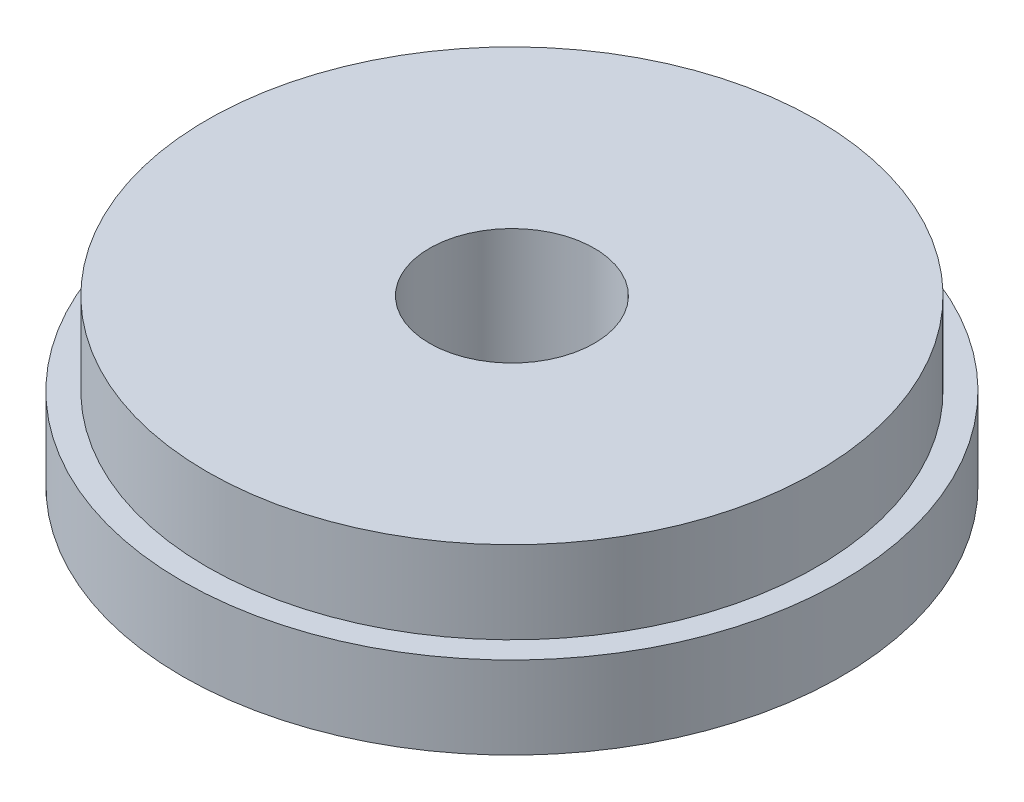
ISO-10303-21;
HEADER;
FILE_DESCRIPTION(('STEP AP214'),'2;1');
FILE_NAME('part.step','',(''),(''),'','','');
FILE_SCHEMA(('AUTOMOTIVE_DESIGN { 1 0 10303 214 1 1 1 1 }'));
ENDSEC;
DATA;
#1=APPLICATION_CONTEXT('core data for automotive mechanical design processes');
#2=APPLICATION_PROTOCOL_DEFINITION('international standard','automotive_design',2000,#1);
#3=PRODUCT_CONTEXT('',#1,'mechanical');
#4=PRODUCT('Part','Part','',(#3));
#5=PRODUCT_RELATED_PRODUCT_CATEGORY('part','',(#4));
#6=PRODUCT_DEFINITION_FORMATION('','',#4);
#7=PRODUCT_DEFINITION_CONTEXT('part definition',#1,'design');
#8=PRODUCT_DEFINITION('design','',#6,#7);
#9=PRODUCT_DEFINITION_SHAPE('','',#8);
#10=(LENGTH_UNIT() NAMED_UNIT(*) SI_UNIT(.MILLI.,.METRE.));
#11=(NAMED_UNIT(*) PLANE_ANGLE_UNIT() SI_UNIT($,.RADIAN.));
#12=(NAMED_UNIT(*) SI_UNIT($,.STERADIAN.) SOLID_ANGLE_UNIT());
#13=UNCERTAINTY_MEASURE_WITH_UNIT(LENGTH_MEASURE(1.E-05),#10,'distance_accuracy_value','');
#14=(GEOMETRIC_REPRESENTATION_CONTEXT(3) GLOBAL_UNCERTAINTY_ASSIGNED_CONTEXT((#13)) GLOBAL_UNIT_ASSIGNED_CONTEXT((#10,
#11,#12)) REPRESENTATION_CONTEXT('',''));
#15=CARTESIAN_POINT('',(0.,0.,0.));
#16=DIRECTION('',(0.,0.,1.));
#17=DIRECTION('',(1.,0.,0.));
#18=AXIS2_PLACEMENT_3D('',#15,#16,#17);
#19=CARTESIAN_POINT('',(0.,5.,0.));
#20=DIRECTION('',(0.,-1.,0.));
#21=DIRECTION('',(0.,0.,-1.));
#22=AXIS2_PLACEMENT_3D('',#19,#20,#21);
#23=CYLINDRICAL_SURFACE('',#22,20.);
#24=CARTESIAN_POINT('',(0.,5.,0.));
#25=DIRECTION('',(0.,1.,0.));
#26=DIRECTION('',(0.,0.,1.));
#27=AXIS2_PLACEMENT_3D('',#24,#25,#26);
#28=CIRCLE('',#27,20.);
#29=CARTESIAN_POINT('',(0.,5.,20.));
#30=VERTEX_POINT('',#29);
#31=EDGE_CURVE('E49',#30,#30,#28,.T.);
#32=ORIENTED_EDGE('',*,*,#31,.F.);
#33=EDGE_LOOP('',(#32));
#34=FACE_BOUND('',#33,.T.);
#35=CARTESIAN_POINT('',(0.,0.,0.));
#36=DIRECTION('',(0.,1.,0.));
#37=DIRECTION('',(0.,0.,1.));
#38=AXIS2_PLACEMENT_3D('',#35,#36,#37);
#39=CIRCLE('',#38,20.);
#40=CARTESIAN_POINT('',(0.,0.,20.));
#41=VERTEX_POINT('',#40);
#42=EDGE_CURVE('E44',#41,#41,#39,.T.);
#43=ORIENTED_EDGE('',*,*,#42,.T.);
#44=EDGE_LOOP('',(#43));
#45=FACE_BOUND('',#44,.T.);
#46=ADVANCED_FACE('F41',(#34,#45),#23,.T.);
#47=CARTESIAN_POINT('',(0.,5.,0.));
#48=DIRECTION('',(0.,1.,0.));
#49=DIRECTION('',(0.,0.,1.));
#50=AXIS2_PLACEMENT_3D('',#47,#48,#49);
#51=PLANE('',#50);
#52=CARTESIAN_POINT('',(0.,5.,0.));
#53=DIRECTION('',(0.,1.,0.));
#54=DIRECTION('',(0.,0.,1.));
#55=AXIS2_PLACEMENT_3D('',#52,#53,#54);
#56=CIRCLE('',#55,18.5);
#57=CARTESIAN_POINT('',(0.,5.,18.5));
#58=VERTEX_POINT('',#57);
#59=EDGE_CURVE('E10',#58,#58,#56,.T.);
#60=ORIENTED_EDGE('',*,*,#59,.F.);
#61=EDGE_LOOP('',(#60));
#62=FACE_BOUND('',#61,.T.);
#63=ORIENTED_EDGE('',*,*,#31,.T.);
#64=EDGE_LOOP('',(#63));
#65=FACE_BOUND('',#64,.T.);
#66=ADVANCED_FACE('F90',(#62,#65),#51,.T.);
#67=CARTESIAN_POINT('',(0.,0.,0.));
#68=DIRECTION('',(0.,1.,0.));
#69=DIRECTION('',(0.,0.,1.));
#70=AXIS2_PLACEMENT_3D('',#67,#68,#69);
#71=PLANE('',#70);
#72=CARTESIAN_POINT('',(0.,0.,0.));
#73=DIRECTION('',(0.,1.,0.));
#74=DIRECTION('',(0.,0.,1.));
#75=AXIS2_PLACEMENT_3D('',#72,#73,#74);
#76=CIRCLE('',#75,5.);
#77=CARTESIAN_POINT('',(0.,0.,5.));
#78=VERTEX_POINT('',#77);
#79=EDGE_CURVE('E60',#78,#78,#76,.T.);
#80=ORIENTED_EDGE('',*,*,#79,.T.);
#81=EDGE_LOOP('',(#80));
#82=FACE_BOUND('',#81,.T.);
#83=ORIENTED_EDGE('',*,*,#42,.F.);
#84=EDGE_LOOP('',(#83));
#85=FACE_BOUND('',#84,.T.);
#86=ADVANCED_FACE('F69',(#82,#85),#71,.F.);
#87=CARTESIAN_POINT('',(0.,10.,0.));
#88=DIRECTION('',(0.,-1.,0.));
#89=DIRECTION('',(0.,0.,-1.));
#90=AXIS2_PLACEMENT_3D('',#87,#88,#89);
#91=CYLINDRICAL_SURFACE('',#90,18.5);
#92=CARTESIAN_POINT('',(0.,10.,0.));
#93=DIRECTION('',(0.,1.,0.));
#94=DIRECTION('',(0.,0.,1.));
#95=AXIS2_PLACEMENT_3D('',#92,#93,#94);
#96=CIRCLE('',#95,18.5);
#97=CARTESIAN_POINT('',(0.,10.,18.5));
#98=VERTEX_POINT('',#97);
#99=EDGE_CURVE('E56',#98,#98,#96,.T.);
#100=ORIENTED_EDGE('',*,*,#99,.F.);
#101=EDGE_LOOP('',(#100));
#102=FACE_BOUND('',#101,.T.);
#103=ORIENTED_EDGE('',*,*,#59,.T.);
#104=EDGE_LOOP('',(#103));
#105=FACE_BOUND('',#104,.T.);
#106=ADVANCED_FACE('F81',(#102,#105),#91,.T.);
#107=CARTESIAN_POINT('',(0.,10.,0.));
#108=DIRECTION('',(0.,1.,0.));
#109=DIRECTION('',(0.,0.,1.));
#110=AXIS2_PLACEMENT_3D('',#107,#108,#109);
#111=PLANE('',#110);
#112=CARTESIAN_POINT('',(0.,10.,0.));
#113=DIRECTION('',(0.,1.,0.));
#114=DIRECTION('',(0.,0.,1.));
#115=AXIS2_PLACEMENT_3D('',#112,#113,#114);
#116=CIRCLE('',#115,5.);
#117=CARTESIAN_POINT('',(0.,10.,5.));
#118=VERTEX_POINT('',#117);
#119=EDGE_CURVE('E61',#118,#118,#116,.T.);
#120=ORIENTED_EDGE('',*,*,#119,.F.);
#121=EDGE_LOOP('',(#120));
#122=FACE_BOUND('',#121,.T.);
#123=ORIENTED_EDGE('',*,*,#99,.T.);
#124=EDGE_LOOP('',(#123));
#125=FACE_BOUND('',#124,.T.);
#126=ADVANCED_FACE('F75',(#122,#125),#111,.T.);
#127=CARTESIAN_POINT('',(0.,0.,0.));
#128=DIRECTION('',(0.,1.,0.));
#129=DIRECTION('',(0.,0.,1.));
#130=AXIS2_PLACEMENT_3D('',#127,#128,#129);
#131=CYLINDRICAL_SURFACE('',#130,5.);
#132=ORIENTED_EDGE('',*,*,#79,.F.);
#133=EDGE_LOOP('',(#132));
#134=FACE_BOUND('',#133,.T.);
#135=ORIENTED_EDGE('',*,*,#119,.T.);
#136=EDGE_LOOP('',(#135));
#137=FACE_BOUND('',#136,.T.);
#138=ADVANCED_FACE('F72',(#134,#137),#131,.F.);
#139=CLOSED_SHELL('',(#46,#66,#86,#106,#126,#138));
#140=MANIFOLD_SOLID_BREP('B2',#139);
#141=ADVANCED_BREP_SHAPE_REPRESENTATION('',(#18,#140),#14);
#142=SHAPE_DEFINITION_REPRESENTATION(#9,#141);
ENDSEC;
END-ISO-10303-21;
